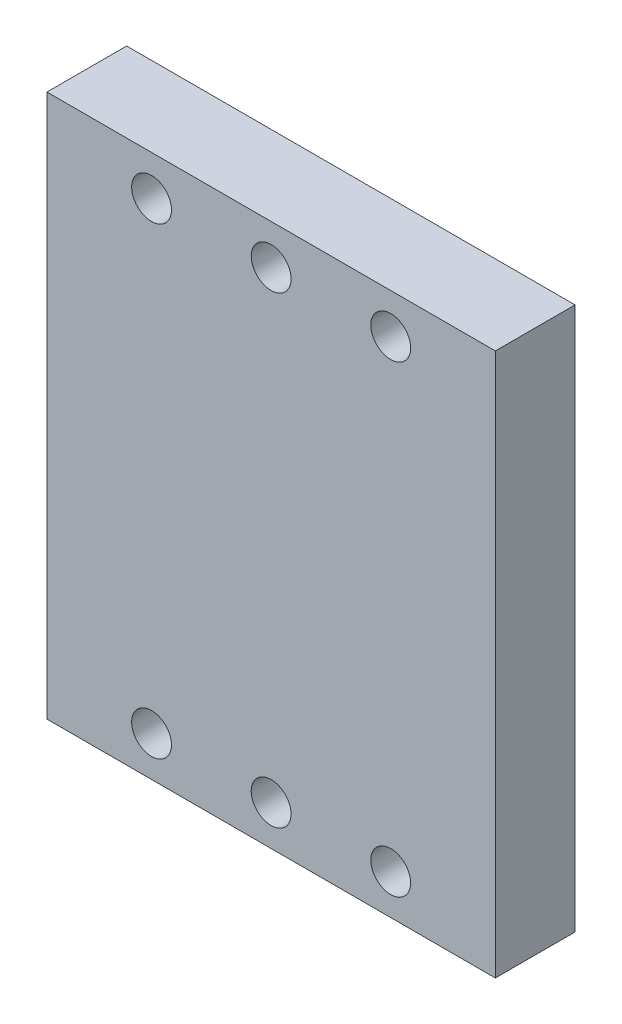
ISO-10303-21;
HEADER;
FILE_DESCRIPTION(('STEP AP214'),'2;1');
FILE_NAME('part.step','',(''),(''),'','','');
FILE_SCHEMA(('AUTOMOTIVE_DESIGN { 1 0 10303 214 1 1 1 1 }'));
ENDSEC;
DATA;
#1=APPLICATION_CONTEXT('core data for automotive mechanical design processes');
#2=APPLICATION_PROTOCOL_DEFINITION('international standard','automotive_design',2000,#1);
#3=PRODUCT_CONTEXT('',#1,'mechanical');
#4=PRODUCT('Part','Part','',(#3));
#5=PRODUCT_RELATED_PRODUCT_CATEGORY('part','',(#4));
#6=PRODUCT_DEFINITION_FORMATION('','',#4);
#7=PRODUCT_DEFINITION_CONTEXT('part definition',#1,'design');
#8=PRODUCT_DEFINITION('design','',#6,#7);
#9=PRODUCT_DEFINITION_SHAPE('','',#8);
#10=(LENGTH_UNIT() NAMED_UNIT(*) SI_UNIT(.MILLI.,.METRE.));
#11=(NAMED_UNIT(*) PLANE_ANGLE_UNIT() SI_UNIT($,.RADIAN.));
#12=(NAMED_UNIT(*) SI_UNIT($,.STERADIAN.) SOLID_ANGLE_UNIT());
#13=UNCERTAINTY_MEASURE_WITH_UNIT(LENGTH_MEASURE(1.E-05),#10,'distance_accuracy_value','');
#14=(GEOMETRIC_REPRESENTATION_CONTEXT(3) GLOBAL_UNCERTAINTY_ASSIGNED_CONTEXT((#13)) GLOBAL_UNIT_ASSIGNED_CONTEXT((#10,
#11,#12)) REPRESENTATION_CONTEXT('',''));
#15=CARTESIAN_POINT('',(0.,0.,0.));
#16=DIRECTION('',(0.,0.,1.));
#17=DIRECTION('',(1.,0.,0.));
#18=AXIS2_PLACEMENT_3D('',#15,#16,#17);
#19=CARTESIAN_POINT('',(0.,0.,8.));
#20=DIRECTION('',(1.,0.,0.));
#21=DIRECTION('',(0.,0.,-1.));
#22=AXIS2_PLACEMENT_3D('',#19,#20,#21);
#23=PLANE('',#22);
#24=DIRECTION('',(0.,-1.,0.));
#25=VECTOR('',#24,1.);
#26=CARTESIAN_POINT('',(0.,0.,0.));
#27=LINE('',#26,#25);
#28=CARTESIAN_POINT('',(0.,54.5,0.));
#29=VERTEX_POINT('',#28);
#30=CARTESIAN_POINT('',(0.,0.,0.));
#31=VERTEX_POINT('',#30);
#32=EDGE_CURVE('E96',#29,#31,#27,.T.);
#33=ORIENTED_EDGE('',*,*,#32,.T.);
#34=DIRECTION('',(0.,0.,-1.));
#35=VECTOR('',#34,1.);
#36=CARTESIAN_POINT('',(0.,0.,8.));
#37=LINE('',#36,#35);
#38=CARTESIAN_POINT('',(0.,0.,8.));
#39=VERTEX_POINT('',#38);
#40=EDGE_CURVE('E11',#39,#31,#37,.T.);
#41=ORIENTED_EDGE('',*,*,#40,.F.);
#42=DIRECTION('',(0.,-1.,0.));
#43=VECTOR('',#42,1.);
#44=CARTESIAN_POINT('',(0.,0.,8.));
#45=LINE('',#44,#43);
#46=CARTESIAN_POINT('',(0.,54.5,8.));
#47=VERTEX_POINT('',#46);
#48=EDGE_CURVE('E84',#47,#39,#45,.T.);
#49=ORIENTED_EDGE('',*,*,#48,.F.);
#50=DIRECTION('',(0.,0.,-1.));
#51=VECTOR('',#50,1.);
#52=CARTESIAN_POINT('',(0.,54.5,8.));
#53=LINE('',#52,#51);
#54=EDGE_CURVE('E92',#47,#29,#53,.T.);
#55=ORIENTED_EDGE('',*,*,#54,.T.);
#56=EDGE_LOOP('',(#33,#41,#49,#55));
#57=FACE_BOUND('',#56,.T.);
#58=ADVANCED_FACE('F33',(#57),#23,.F.);
#59=CARTESIAN_POINT('',(0.,0.,8.));
#60=DIRECTION('',(0.,1.,0.));
#61=DIRECTION('',(0.,0.,1.));
#62=AXIS2_PLACEMENT_3D('',#59,#60,#61);
#63=PLANE('',#62);
#64=DIRECTION('',(1.,0.,0.));
#65=VECTOR('',#64,1.);
#66=CARTESIAN_POINT('',(0.,0.,0.));
#67=LINE('',#66,#65);
#68=CARTESIAN_POINT('',(45.,0.,0.));
#69=VERTEX_POINT('',#68);
#70=EDGE_CURVE('E88',#31,#69,#67,.T.);
#71=ORIENTED_EDGE('',*,*,#70,.T.);
#72=DIRECTION('',(0.,0.,-1.));
#73=VECTOR('',#72,1.);
#74=CARTESIAN_POINT('',(45.,0.,8.));
#75=LINE('',#74,#73);
#76=CARTESIAN_POINT('',(45.,0.,8.));
#77=VERTEX_POINT('',#76);
#78=EDGE_CURVE('E41',#77,#69,#75,.T.);
#79=ORIENTED_EDGE('',*,*,#78,.F.);
#80=DIRECTION('',(1.,0.,0.));
#81=VECTOR('',#80,1.);
#82=CARTESIAN_POINT('',(0.,0.,8.));
#83=LINE('',#82,#81);
#84=EDGE_CURVE('E79',#39,#77,#83,.T.);
#85=ORIENTED_EDGE('',*,*,#84,.F.);
#86=ORIENTED_EDGE('',*,*,#40,.T.);
#87=EDGE_LOOP('',(#71,#79,#85,#86));
#88=FACE_BOUND('',#87,.T.);
#89=ADVANCED_FACE('F87',(#88),#63,.F.);
#90=CARTESIAN_POINT('',(45.,0.,8.));
#91=DIRECTION('',(-1.,0.,0.));
#92=DIRECTION('',(0.,0.,1.));
#93=AXIS2_PLACEMENT_3D('',#90,#91,#92);
#94=PLANE('',#93);
#95=DIRECTION('',(0.,1.,0.));
#96=VECTOR('',#95,1.);
#97=CARTESIAN_POINT('',(45.,0.,0.));
#98=LINE('',#97,#96);
#99=CARTESIAN_POINT('',(45.,54.5,0.));
#100=VERTEX_POINT('',#99);
#101=EDGE_CURVE('E66',#69,#100,#98,.T.);
#102=ORIENTED_EDGE('',*,*,#101,.T.);
#103=DIRECTION('',(0.,0.,-1.));
#104=VECTOR('',#103,1.);
#105=CARTESIAN_POINT('',(45.,54.5,8.));
#106=LINE('',#105,#104);
#107=CARTESIAN_POINT('',(45.,54.5,8.));
#108=VERTEX_POINT('',#107);
#109=EDGE_CURVE('E89',#108,#100,#106,.T.);
#110=ORIENTED_EDGE('',*,*,#109,.F.);
#111=DIRECTION('',(0.,1.,0.));
#112=VECTOR('',#111,1.);
#113=CARTESIAN_POINT('',(45.,0.,8.));
#114=LINE('',#113,#112);
#115=EDGE_CURVE('E82',#77,#108,#114,.T.);
#116=ORIENTED_EDGE('',*,*,#115,.F.);
#117=ORIENTED_EDGE('',*,*,#78,.T.);
#118=EDGE_LOOP('',(#102,#110,#116,#117));
#119=FACE_BOUND('',#118,.T.);
#120=ADVANCED_FACE('F90',(#119),#94,.F.);
#121=CARTESIAN_POINT('',(0.,54.5,8.));
#122=DIRECTION('',(0.,-1.,0.));
#123=DIRECTION('',(0.,0.,-1.));
#124=AXIS2_PLACEMENT_3D('',#121,#122,#123);
#125=PLANE('',#124);
#126=DIRECTION('',(-1.,0.,0.));
#127=VECTOR('',#126,1.);
#128=CARTESIAN_POINT('',(0.,54.5,0.));
#129=LINE('',#128,#127);
#130=EDGE_CURVE('E72',#100,#29,#129,.T.);
#131=ORIENTED_EDGE('',*,*,#130,.T.);
#132=ORIENTED_EDGE('',*,*,#54,.F.);
#133=DIRECTION('',(-1.,0.,0.));
#134=VECTOR('',#133,1.);
#135=CARTESIAN_POINT('',(0.,54.5,8.));
#136=LINE('',#135,#134);
#137=EDGE_CURVE('E49',#108,#47,#136,.T.);
#138=ORIENTED_EDGE('',*,*,#137,.F.);
#139=ORIENTED_EDGE('',*,*,#109,.T.);
#140=EDGE_LOOP('',(#131,#132,#138,#139));
#141=FACE_BOUND('',#140,.T.);
#142=ADVANCED_FACE('F104',(#141),#125,.F.);
#143=CARTESIAN_POINT('',(0.,0.,8.));
#144=DIRECTION('',(0.,0.,-1.));
#145=DIRECTION('',(-1.,0.,0.));
#146=AXIS2_PLACEMENT_3D('',#143,#144,#145);
#147=PLANE('',#146);
#148=CARTESIAN_POINT('',(22.5,4.,8.));
#149=DIRECTION('',(0.,0.,1.));
#150=DIRECTION('',(1.,0.,0.));
#151=AXIS2_PLACEMENT_3D('',#148,#149,#150);
#152=CIRCLE('',#151,2.);
#153=CARTESIAN_POINT('',(24.5,4.,8.));
#154=VERTEX_POINT('',#153);
#155=EDGE_CURVE('E140',#154,#154,#152,.T.);
#156=ORIENTED_EDGE('',*,*,#155,.F.);
#157=EDGE_LOOP('',(#156));
#158=FACE_BOUND('',#157,.T.);
#159=CARTESIAN_POINT('',(10.5,4.,8.));
#160=DIRECTION('',(0.,0.,1.));
#161=DIRECTION('',(-1.,0.,0.));
#162=AXIS2_PLACEMENT_3D('',#159,#160,#161);
#163=CIRCLE('',#162,2.);
#164=CARTESIAN_POINT('',(8.49999999999999,4.,8.));
#165=VERTEX_POINT('',#164);
#166=EDGE_CURVE('E123',#165,#165,#163,.T.);
#167=ORIENTED_EDGE('',*,*,#166,.F.);
#168=EDGE_LOOP('',(#167));
#169=FACE_BOUND('',#168,.T.);
#170=CARTESIAN_POINT('',(10.5,50.5,8.));
#171=DIRECTION('',(0.,0.,1.));
#172=DIRECTION('',(1.,0.,0.));
#173=AXIS2_PLACEMENT_3D('',#170,#171,#172);
#174=CIRCLE('',#173,2.);
#175=CARTESIAN_POINT('',(12.5,50.5,8.));
#176=VERTEX_POINT('',#175);
#177=EDGE_CURVE('E124',#176,#176,#174,.T.);
#178=ORIENTED_EDGE('',*,*,#177,.F.);
#179=EDGE_LOOP('',(#178));
#180=FACE_BOUND('',#179,.T.);
#181=CARTESIAN_POINT('',(34.5,50.5,8.));
#182=DIRECTION('',(0.,0.,1.));
#183=DIRECTION('',(-1.,0.,0.));
#184=AXIS2_PLACEMENT_3D('',#181,#182,#183);
#185=CIRCLE('',#184,2.);
#186=CARTESIAN_POINT('',(32.5,50.5,8.));
#187=VERTEX_POINT('',#186);
#188=EDGE_CURVE('E130',#187,#187,#185,.T.);
#189=ORIENTED_EDGE('',*,*,#188,.F.);
#190=EDGE_LOOP('',(#189));
#191=FACE_BOUND('',#190,.T.);
#192=CARTESIAN_POINT('',(22.5,50.5,8.));
#193=DIRECTION('',(0.,0.,1.));
#194=DIRECTION('',(-1.,0.,0.));
#195=AXIS2_PLACEMENT_3D('',#192,#193,#194);
#196=CIRCLE('',#195,2.);
#197=CARTESIAN_POINT('',(20.5,50.5,8.));
#198=VERTEX_POINT('',#197);
#199=EDGE_CURVE('E116',#198,#198,#196,.T.);
#200=ORIENTED_EDGE('',*,*,#199,.F.);
#201=EDGE_LOOP('',(#200));
#202=FACE_BOUND('',#201,.T.);
#203=CARTESIAN_POINT('',(34.5,4.,8.));
#204=DIRECTION('',(0.,0.,1.));
#205=DIRECTION('',(1.,0.,0.));
#206=AXIS2_PLACEMENT_3D('',#203,#204,#205);
#207=CIRCLE('',#206,2.);
#208=CARTESIAN_POINT('',(36.5,4.,8.));
#209=VERTEX_POINT('',#208);
#210=EDGE_CURVE('E110',#209,#209,#207,.T.);
#211=ORIENTED_EDGE('',*,*,#210,.F.);
#212=EDGE_LOOP('',(#211));
#213=FACE_BOUND('',#212,.T.);
#214=ORIENTED_EDGE('',*,*,#48,.T.);
#215=ORIENTED_EDGE('',*,*,#84,.T.);
#216=ORIENTED_EDGE('',*,*,#115,.T.);
#217=ORIENTED_EDGE('',*,*,#137,.T.);
#218=EDGE_LOOP('',(#214,#215,#216,#217));
#219=FACE_BOUND('',#218,.T.);
#220=ADVANCED_FACE('F80',(#158,#169,#180,#191,#202,#213,#219),#147,.F.);
#221=CARTESIAN_POINT('',(0.,0.,0.));
#222=DIRECTION('',(0.,0.,-1.));
#223=DIRECTION('',(-1.,0.,0.));
#224=AXIS2_PLACEMENT_3D('',#221,#222,#223);
#225=PLANE('',#224);
#226=CARTESIAN_POINT('',(22.5,4.,0.));
#227=DIRECTION('',(0.,0.,1.));
#228=DIRECTION('',(1.,0.,0.));
#229=AXIS2_PLACEMENT_3D('',#226,#227,#228);
#230=CIRCLE('',#229,2.);
#231=CARTESIAN_POINT('',(24.5,4.,0.));
#232=VERTEX_POINT('',#231);
#233=EDGE_CURVE('E113',#232,#232,#230,.T.);
#234=ORIENTED_EDGE('',*,*,#233,.T.);
#235=EDGE_LOOP('',(#234));
#236=FACE_BOUND('',#235,.T.);
#237=CARTESIAN_POINT('',(10.5,4.,0.));
#238=DIRECTION('',(0.,0.,1.));
#239=DIRECTION('',(-1.,0.,0.));
#240=AXIS2_PLACEMENT_3D('',#237,#238,#239);
#241=CIRCLE('',#240,2.);
#242=CARTESIAN_POINT('',(8.49999999999999,4.,0.));
#243=VERTEX_POINT('',#242);
#244=EDGE_CURVE('E137',#243,#243,#241,.T.);
#245=ORIENTED_EDGE('',*,*,#244,.T.);
#246=EDGE_LOOP('',(#245));
#247=FACE_BOUND('',#246,.T.);
#248=CARTESIAN_POINT('',(10.5,50.5,0.));
#249=DIRECTION('',(0.,0.,1.));
#250=DIRECTION('',(1.,0.,0.));
#251=AXIS2_PLACEMENT_3D('',#248,#249,#250);
#252=CIRCLE('',#251,2.);
#253=CARTESIAN_POINT('',(12.5,50.5,0.));
#254=VERTEX_POINT('',#253);
#255=EDGE_CURVE('E127',#254,#254,#252,.T.);
#256=ORIENTED_EDGE('',*,*,#255,.T.);
#257=EDGE_LOOP('',(#256));
#258=FACE_BOUND('',#257,.T.);
#259=CARTESIAN_POINT('',(34.5,50.5,0.));
#260=DIRECTION('',(0.,0.,1.));
#261=DIRECTION('',(-1.,0.,0.));
#262=AXIS2_PLACEMENT_3D('',#259,#260,#261);
#263=CIRCLE('',#262,2.);
#264=CARTESIAN_POINT('',(32.5,50.5,0.));
#265=VERTEX_POINT('',#264);
#266=EDGE_CURVE('E120',#265,#265,#263,.T.);
#267=ORIENTED_EDGE('',*,*,#266,.T.);
#268=EDGE_LOOP('',(#267));
#269=FACE_BOUND('',#268,.T.);
#270=CARTESIAN_POINT('',(22.5,50.5,0.));
#271=DIRECTION('',(0.,0.,1.));
#272=DIRECTION('',(-1.,0.,0.));
#273=AXIS2_PLACEMENT_3D('',#270,#271,#272);
#274=CIRCLE('',#273,2.);
#275=CARTESIAN_POINT('',(20.5,50.5,0.));
#276=VERTEX_POINT('',#275);
#277=EDGE_CURVE('E119',#276,#276,#274,.T.);
#278=ORIENTED_EDGE('',*,*,#277,.T.);
#279=EDGE_LOOP('',(#278));
#280=FACE_BOUND('',#279,.T.);
#281=CARTESIAN_POINT('',(34.5,4.,0.));
#282=DIRECTION('',(0.,0.,1.));
#283=DIRECTION('',(1.,0.,0.));
#284=AXIS2_PLACEMENT_3D('',#281,#282,#283);
#285=CIRCLE('',#284,2.);
#286=CARTESIAN_POINT('',(36.5,4.,0.));
#287=VERTEX_POINT('',#286);
#288=EDGE_CURVE('E99',#287,#287,#285,.T.);
#289=ORIENTED_EDGE('',*,*,#288,.T.);
#290=EDGE_LOOP('',(#289));
#291=FACE_BOUND('',#290,.T.);
#292=ORIENTED_EDGE('',*,*,#32,.F.);
#293=ORIENTED_EDGE('',*,*,#130,.F.);
#294=ORIENTED_EDGE('',*,*,#101,.F.);
#295=ORIENTED_EDGE('',*,*,#70,.F.);
#296=EDGE_LOOP('',(#292,#293,#294,#295));
#297=FACE_BOUND('',#296,.T.);
#298=ADVANCED_FACE('F107',(#236,#247,#258,#269,#280,#291,#297),#225,.T.);
#299=CARTESIAN_POINT('',(34.5,4.,0.));
#300=DIRECTION('',(0.,0.,1.));
#301=DIRECTION('',(1.,0.,0.));
#302=AXIS2_PLACEMENT_3D('',#299,#300,#301);
#303=CYLINDRICAL_SURFACE('',#302,2.);
#304=ORIENTED_EDGE('',*,*,#288,.F.);
#305=EDGE_LOOP('',(#304));
#306=FACE_BOUND('',#305,.T.);
#307=ORIENTED_EDGE('',*,*,#210,.T.);
#308=EDGE_LOOP('',(#307));
#309=FACE_BOUND('',#308,.T.);
#310=ADVANCED_FACE('F168',(#306,#309),#303,.F.);
#311=CARTESIAN_POINT('',(22.5,50.5,0.));
#312=DIRECTION('',(0.,0.,1.));
#313=DIRECTION('',(1.,0.,0.));
#314=AXIS2_PLACEMENT_3D('',#311,#312,#313);
#315=CYLINDRICAL_SURFACE('',#314,2.);
#316=ORIENTED_EDGE('',*,*,#277,.F.);
#317=EDGE_LOOP('',(#316));
#318=FACE_BOUND('',#317,.T.);
#319=ORIENTED_EDGE('',*,*,#199,.T.);
#320=EDGE_LOOP('',(#319));
#321=FACE_BOUND('',#320,.T.);
#322=ADVANCED_FACE('F170',(#318,#321),#315,.F.);
#323=CARTESIAN_POINT('',(34.5,50.5,0.));
#324=DIRECTION('',(0.,0.,1.));
#325=DIRECTION('',(1.,0.,0.));
#326=AXIS2_PLACEMENT_3D('',#323,#324,#325);
#327=CYLINDRICAL_SURFACE('',#326,2.);
#328=ORIENTED_EDGE('',*,*,#266,.F.);
#329=EDGE_LOOP('',(#328));
#330=FACE_BOUND('',#329,.T.);
#331=ORIENTED_EDGE('',*,*,#188,.T.);
#332=EDGE_LOOP('',(#331));
#333=FACE_BOUND('',#332,.T.);
#334=ADVANCED_FACE('F177',(#330,#333),#327,.F.);
#335=CARTESIAN_POINT('',(10.5,50.5,0.));
#336=DIRECTION('',(0.,0.,1.));
#337=DIRECTION('',(1.,0.,0.));
#338=AXIS2_PLACEMENT_3D('',#335,#336,#337);
#339=CYLINDRICAL_SURFACE('',#338,2.);
#340=ORIENTED_EDGE('',*,*,#255,.F.);
#341=EDGE_LOOP('',(#340));
#342=FACE_BOUND('',#341,.T.);
#343=ORIENTED_EDGE('',*,*,#177,.T.);
#344=EDGE_LOOP('',(#343));
#345=FACE_BOUND('',#344,.T.);
#346=ADVANCED_FACE('F223',(#342,#345),#339,.F.);
#347=CARTESIAN_POINT('',(10.5,4.,0.));
#348=DIRECTION('',(0.,0.,1.));
#349=DIRECTION('',(1.,0.,0.));
#350=AXIS2_PLACEMENT_3D('',#347,#348,#349);
#351=CYLINDRICAL_SURFACE('',#350,2.);
#352=ORIENTED_EDGE('',*,*,#244,.F.);
#353=EDGE_LOOP('',(#352));
#354=FACE_BOUND('',#353,.T.);
#355=ORIENTED_EDGE('',*,*,#166,.T.);
#356=EDGE_LOOP('',(#355));
#357=FACE_BOUND('',#356,.T.);
#358=ADVANCED_FACE('F151',(#354,#357),#351,.F.);
#359=CARTESIAN_POINT('',(22.5,4.,0.));
#360=DIRECTION('',(0.,0.,1.));
#361=DIRECTION('',(1.,0.,0.));
#362=AXIS2_PLACEMENT_3D('',#359,#360,#361);
#363=CYLINDRICAL_SURFACE('',#362,2.);
#364=ORIENTED_EDGE('',*,*,#233,.F.);
#365=EDGE_LOOP('',(#364));
#366=FACE_BOUND('',#365,.T.);
#367=ORIENTED_EDGE('',*,*,#155,.T.);
#368=EDGE_LOOP('',(#367));
#369=FACE_BOUND('',#368,.T.);
#370=ADVANCED_FACE('F148',(#366,#369),#363,.F.);
#371=CLOSED_SHELL('',(#58,#89,#120,#142,#220,#298,#310,#322,#334,#346,#358,#370));
#372=MANIFOLD_SOLID_BREP('B2',#371);
#373=ADVANCED_BREP_SHAPE_REPRESENTATION('',(#18,#372),#14);
#374=SHAPE_DEFINITION_REPRESENTATION(#9,#373);
ENDSEC;
END-ISO-10303-21;
